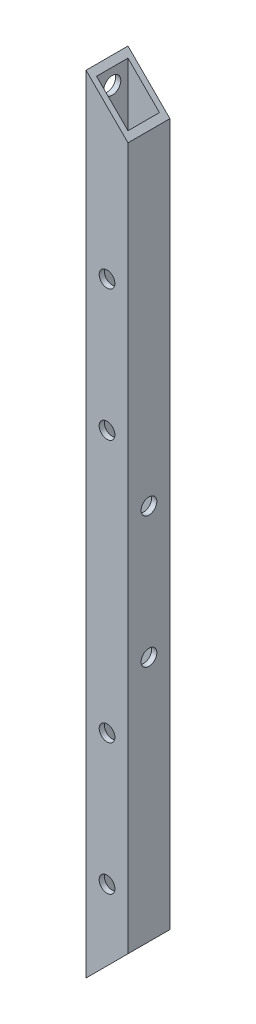
ISO-10303-21;
HEADER;
FILE_DESCRIPTION(('STEP AP214'),'2;1');
FILE_NAME('part.step','',(''),(''),'','','');
FILE_SCHEMA(('AUTOMOTIVE_DESIGN { 1 0 10303 214 1 1 1 1 }'));
ENDSEC;
DATA;
#1=APPLICATION_CONTEXT('core data for automotive mechanical design processes');
#2=APPLICATION_PROTOCOL_DEFINITION('international standard','automotive_design',2000,#1);
#3=PRODUCT_CONTEXT('',#1,'mechanical');
#4=PRODUCT('Part','Part','',(#3));
#5=PRODUCT_RELATED_PRODUCT_CATEGORY('part','',(#4));
#6=PRODUCT_DEFINITION_FORMATION('','',#4);
#7=PRODUCT_DEFINITION_CONTEXT('part definition',#1,'design');
#8=PRODUCT_DEFINITION('design','',#6,#7);
#9=PRODUCT_DEFINITION_SHAPE('','',#8);
#10=(LENGTH_UNIT() NAMED_UNIT(*) SI_UNIT(.MILLI.,.METRE.));
#11=(NAMED_UNIT(*) PLANE_ANGLE_UNIT() SI_UNIT($,.RADIAN.));
#12=(NAMED_UNIT(*) SI_UNIT($,.STERADIAN.) SOLID_ANGLE_UNIT());
#13=UNCERTAINTY_MEASURE_WITH_UNIT(LENGTH_MEASURE(1.E-05),#10,'distance_accuracy_value','');
#14=(GEOMETRIC_REPRESENTATION_CONTEXT(3) GLOBAL_UNCERTAINTY_ASSIGNED_CONTEXT((#13)) GLOBAL_UNIT_ASSIGNED_CONTEXT((#10,
#11,#12)) REPRESENTATION_CONTEXT('',''));
#15=CARTESIAN_POINT('',(0.,0.,0.));
#16=DIRECTION('',(0.,0.,1.));
#17=DIRECTION('',(1.,0.,0.));
#18=AXIS2_PLACEMENT_3D('',#15,#16,#17);
#19=CARTESIAN_POINT('',(4.,150.,-4.));
#20=DIRECTION('',(-1.,0.,0.));
#21=DIRECTION('',(0.,0.,1.));
#22=AXIS2_PLACEMENT_3D('',#19,#20,#21);
#23=PLANE('',#22);
#24=CARTESIAN_POINT('',(4.,80.,0.));
#25=DIRECTION('',(1.,0.,0.));
#26=DIRECTION('',(0.,0.,-1.));
#27=AXIS2_PLACEMENT_3D('',#24,#25,#26);
#28=CIRCLE('',#27,1.5);
#29=CARTESIAN_POINT('',(4.,80.,-1.50000000000001));
#30=VERTEX_POINT('',#29);
#31=EDGE_CURVE('E153',#30,#30,#28,.T.);
#32=ORIENTED_EDGE('',*,*,#31,.F.);
#33=EDGE_LOOP('',(#32));
#34=FACE_BOUND('',#33,.T.);
#35=CARTESIAN_POINT('',(4.,55.,0.));
#36=DIRECTION('',(1.,0.,0.));
#37=DIRECTION('',(0.,0.,-1.));
#38=AXIS2_PLACEMENT_3D('',#35,#36,#37);
#39=CIRCLE('',#38,1.5);
#40=CARTESIAN_POINT('',(4.,55.,-1.50000000000001));
#41=VERTEX_POINT('',#40);
#42=EDGE_CURVE('E229',#41,#41,#39,.T.);
#43=ORIENTED_EDGE('',*,*,#42,.F.);
#44=EDGE_LOOP('',(#43));
#45=FACE_BOUND('',#44,.T.);
#46=DIRECTION('',(0.,-1.,0.));
#47=VECTOR('',#46,1.);
#48=CARTESIAN_POINT('',(4.,150.,-4.));
#49=LINE('',#48,#47);
#50=CARTESIAN_POINT('',(4.,142.,-4.));
#51=VERTEX_POINT('',#50);
#52=CARTESIAN_POINT('',(4.,7.99999999999984,-4.));
#53=VERTEX_POINT('',#52);
#54=EDGE_CURVE('E133',#51,#53,#49,.T.);
#55=ORIENTED_EDGE('',*,*,#54,.F.);
#56=DIRECTION('',(0.,0.,-1.));
#57=VECTOR('',#56,1.);
#58=CARTESIAN_POINT('',(4.,142.,6.));
#59=LINE('',#58,#57);
#60=CARTESIAN_POINT('',(4.,142.,4.));
#61=VERTEX_POINT('',#60);
#62=EDGE_CURVE('E115',#61,#51,#59,.T.);
#63=ORIENTED_EDGE('',*,*,#62,.F.);
#64=DIRECTION('',(0.,-1.,0.));
#65=VECTOR('',#64,1.);
#66=CARTESIAN_POINT('',(4.,150.,4.));
#67=LINE('',#66,#65);
#68=CARTESIAN_POINT('',(4.,7.99999999999984,4.));
#69=VERTEX_POINT('',#68);
#70=EDGE_CURVE('E269',#61,#69,#67,.T.);
#71=ORIENTED_EDGE('',*,*,#70,.T.);
#72=DIRECTION('',(0.,0.,-1.));
#73=VECTOR('',#72,1.);
#74=CARTESIAN_POINT('',(4.,7.99999999999984,6.));
#75=LINE('',#74,#73);
#76=EDGE_CURVE('E67',#69,#53,#75,.T.);
#77=ORIENTED_EDGE('',*,*,#76,.T.);
#78=EDGE_LOOP('',(#55,#63,#71,#77));
#79=FACE_BOUND('',#78,.T.);
#80=ADVANCED_FACE('F50',(#34,#45,#79),#23,.F.);
#81=CARTESIAN_POINT('',(-4.,150.,-4.));
#82=DIRECTION('',(0.,0.,1.));
#83=DIRECTION('',(1.,0.,0.));
#84=AXIS2_PLACEMENT_3D('',#81,#82,#83);
#85=PLANE('',#84);
#86=CARTESIAN_POINT('',(0.,17.5,-4.));
#87=DIRECTION('',(0.,0.,1.));
#88=DIRECTION('',(1.,0.,0.));
#89=AXIS2_PLACEMENT_3D('',#86,#87,#88);
#90=CIRCLE('',#89,1.5);
#91=CARTESIAN_POINT('',(1.50000000000002,17.5,-4.));
#92=VERTEX_POINT('',#91);
#93=EDGE_CURVE('E199',#92,#92,#90,.T.);
#94=ORIENTED_EDGE('',*,*,#93,.T.);
#95=EDGE_LOOP('',(#94));
#96=FACE_BOUND('',#95,.T.);
#97=CARTESIAN_POINT('',(0.,42.5,-4.));
#98=DIRECTION('',(0.,0.,1.));
#99=DIRECTION('',(1.,0.,0.));
#100=AXIS2_PLACEMENT_3D('',#97,#98,#99);
#101=CIRCLE('',#100,1.5);
#102=CARTESIAN_POINT('',(1.50000000000002,42.5,-4.));
#103=VERTEX_POINT('',#102);
#104=EDGE_CURVE('E181',#103,#103,#101,.T.);
#105=ORIENTED_EDGE('',*,*,#104,.T.);
#106=EDGE_LOOP('',(#105));
#107=FACE_BOUND('',#106,.T.);
#108=CARTESIAN_POINT('',(0.,92.5,-4.));
#109=DIRECTION('',(0.,0.,1.));
#110=DIRECTION('',(1.,0.,0.));
#111=AXIS2_PLACEMENT_3D('',#108,#109,#110);
#112=CIRCLE('',#111,1.5);
#113=CARTESIAN_POINT('',(1.50000000000002,92.5,-4.));
#114=VERTEX_POINT('',#113);
#115=EDGE_CURVE('E175',#114,#114,#112,.T.);
#116=ORIENTED_EDGE('',*,*,#115,.T.);
#117=EDGE_LOOP('',(#116));
#118=FACE_BOUND('',#117,.T.);
#119=CARTESIAN_POINT('',(0.,117.5,-4.));
#120=DIRECTION('',(0.,0.,1.));
#121=DIRECTION('',(1.,0.,0.));
#122=AXIS2_PLACEMENT_3D('',#119,#120,#121);
#123=CIRCLE('',#122,1.5);
#124=CARTESIAN_POINT('',(1.50000000000001,117.5,-4.));
#125=VERTEX_POINT('',#124);
#126=EDGE_CURVE('E170',#125,#125,#123,.T.);
#127=ORIENTED_EDGE('',*,*,#126,.T.);
#128=EDGE_LOOP('',(#127));
#129=FACE_BOUND('',#128,.T.);
#130=DIRECTION('',(0.,-1.,0.));
#131=VECTOR('',#130,1.);
#132=CARTESIAN_POINT('',(-4.,150.,-4.));
#133=LINE('',#132,#131);
#134=CARTESIAN_POINT('',(-4.,150.,-4.));
#135=VERTEX_POINT('',#134);
#136=CARTESIAN_POINT('',(-4.,0.,-4.));
#137=VERTEX_POINT('',#136);
#138=EDGE_CURVE('E135',#135,#137,#133,.T.);
#139=ORIENTED_EDGE('',*,*,#138,.F.);
#140=DIRECTION('',(-0.70710678118654,0.707106781186555,0.));
#141=VECTOR('',#140,1.);
#142=CARTESIAN_POINT('',(-4.,150.,-4.));
#143=LINE('',#142,#141);
#144=EDGE_CURVE('E118',#51,#135,#143,.T.);
#145=ORIENTED_EDGE('',*,*,#144,.F.);
#146=ORIENTED_EDGE('',*,*,#54,.T.);
#147=DIRECTION('',(0.707106781186555,0.70710678118654,0.));
#148=VECTOR('',#147,1.);
#149=CARTESIAN_POINT('',(-4.,0.,-4.));
#150=LINE('',#149,#148);
#151=EDGE_CURVE('E202',#137,#53,#150,.T.);
#152=ORIENTED_EDGE('',*,*,#151,.F.);
#153=EDGE_LOOP('',(#139,#145,#146,#152));
#154=FACE_BOUND('',#153,.T.);
#155=ADVANCED_FACE('F131',(#96,#107,#118,#129,#154),#85,.F.);
#156=CARTESIAN_POINT('',(-4.,150.,-4.));
#157=DIRECTION('',(1.,0.,0.));
#158=DIRECTION('',(0.,0.,-1.));
#159=AXIS2_PLACEMENT_3D('',#156,#157,#158);
#160=PLANE('',#159);
#161=CARTESIAN_POINT('',(-4.,146.,0.));
#162=DIRECTION('',(1.,0.,0.));
#163=DIRECTION('',(0.,0.,-1.));
#164=AXIS2_PLACEMENT_3D('',#161,#162,#163);
#165=CIRCLE('',#164,1.625);
#166=CARTESIAN_POINT('',(-4.,146.,-1.625));
#167=VERTEX_POINT('',#166);
#168=EDGE_CURVE('E393',#167,#167,#165,.T.);
#169=ORIENTED_EDGE('',*,*,#168,.T.);
#170=EDGE_LOOP('',(#169));
#171=FACE_BOUND('',#170,.T.);
#172=CARTESIAN_POINT('',(-4.,4.,0.));
#173=DIRECTION('',(1.,0.,0.));
#174=DIRECTION('',(0.,0.,-1.));
#175=AXIS2_PLACEMENT_3D('',#172,#173,#174);
#176=CIRCLE('',#175,1.625);
#177=CARTESIAN_POINT('',(-4.,4.,-1.625));
#178=VERTEX_POINT('',#177);
#179=EDGE_CURVE('E387',#178,#178,#176,.T.);
#180=ORIENTED_EDGE('',*,*,#179,.T.);
#181=EDGE_LOOP('',(#180));
#182=FACE_BOUND('',#181,.T.);
#183=CARTESIAN_POINT('',(-4.,80.,0.));
#184=DIRECTION('',(1.,0.,0.));
#185=DIRECTION('',(0.,0.,-1.));
#186=AXIS2_PLACEMENT_3D('',#183,#184,#185);
#187=CIRCLE('',#186,1.5);
#188=CARTESIAN_POINT('',(-4.,80.,-1.50000000000001));
#189=VERTEX_POINT('',#188);
#190=EDGE_CURVE('E245',#189,#189,#187,.T.);
#191=ORIENTED_EDGE('',*,*,#190,.T.);
#192=EDGE_LOOP('',(#191));
#193=FACE_BOUND('',#192,.T.);
#194=CARTESIAN_POINT('',(-4.,55.,0.));
#195=DIRECTION('',(1.,0.,0.));
#196=DIRECTION('',(0.,0.,-1.));
#197=AXIS2_PLACEMENT_3D('',#194,#195,#196);
#198=CIRCLE('',#197,1.5);
#199=CARTESIAN_POINT('',(-4.,55.,-1.50000000000001));
#200=VERTEX_POINT('',#199);
#201=EDGE_CURVE('E158',#200,#200,#198,.T.);
#202=ORIENTED_EDGE('',*,*,#201,.T.);
#203=EDGE_LOOP('',(#202));
#204=FACE_BOUND('',#203,.T.);
#205=DIRECTION('',(0.,0.,1.));
#206=VECTOR('',#205,1.);
#207=CARTESIAN_POINT('',(-4.,0.,-4.));
#208=LINE('',#207,#206);
#209=CARTESIAN_POINT('',(-4.,0.,4.));
#210=VERTEX_POINT('',#209);
#211=EDGE_CURVE('E265',#137,#210,#208,.T.);
#212=ORIENTED_EDGE('',*,*,#211,.T.);
#213=DIRECTION('',(0.,-1.,0.));
#214=VECTOR('',#213,1.);
#215=CARTESIAN_POINT('',(-4.,150.,4.));
#216=LINE('',#215,#214);
#217=CARTESIAN_POINT('',(-4.,150.,4.));
#218=VERTEX_POINT('',#217);
#219=EDGE_CURVE('E144',#218,#210,#216,.T.);
#220=ORIENTED_EDGE('',*,*,#219,.F.);
#221=DIRECTION('',(0.,0.,1.));
#222=VECTOR('',#221,1.);
#223=CARTESIAN_POINT('',(-4.,150.,-4.));
#224=LINE('',#223,#222);
#225=EDGE_CURVE('E266',#135,#218,#224,.T.);
#226=ORIENTED_EDGE('',*,*,#225,.F.);
#227=ORIENTED_EDGE('',*,*,#138,.T.);
#228=EDGE_LOOP('',(#212,#220,#226,#227));
#229=FACE_BOUND('',#228,.T.);
#230=ADVANCED_FACE('F280',(#171,#182,#193,#204,#229),#160,.F.);
#231=CARTESIAN_POINT('',(-4.,150.,4.));
#232=DIRECTION('',(0.,0.,-1.));
#233=DIRECTION('',(-1.,0.,0.));
#234=AXIS2_PLACEMENT_3D('',#231,#232,#233);
#235=PLANE('',#234);
#236=CARTESIAN_POINT('',(0.,17.5,4.));
#237=DIRECTION('',(0.,0.,1.));
#238=DIRECTION('',(1.,0.,0.));
#239=AXIS2_PLACEMENT_3D('',#236,#237,#238);
#240=CIRCLE('',#239,1.5);
#241=CARTESIAN_POINT('',(1.50000000000002,17.5,4.));
#242=VERTEX_POINT('',#241);
#243=EDGE_CURVE('E165',#242,#242,#240,.T.);
#244=ORIENTED_EDGE('',*,*,#243,.F.);
#245=EDGE_LOOP('',(#244));
#246=FACE_BOUND('',#245,.T.);
#247=CARTESIAN_POINT('',(0.,42.5,4.));
#248=DIRECTION('',(0.,0.,1.));
#249=DIRECTION('',(1.,0.,0.));
#250=AXIS2_PLACEMENT_3D('',#247,#248,#249);
#251=CIRCLE('',#250,1.5);
#252=CARTESIAN_POINT('',(1.50000000000002,42.5,4.));
#253=VERTEX_POINT('',#252);
#254=EDGE_CURVE('E400',#253,#253,#251,.T.);
#255=ORIENTED_EDGE('',*,*,#254,.F.);
#256=EDGE_LOOP('',(#255));
#257=FACE_BOUND('',#256,.T.);
#258=CARTESIAN_POINT('',(0.,92.5,4.));
#259=DIRECTION('',(0.,0.,1.));
#260=DIRECTION('',(-1.,0.,0.));
#261=AXIS2_PLACEMENT_3D('',#258,#259,#260);
#262=CIRCLE('',#261,1.5);
#263=CARTESIAN_POINT('',(-1.49999999999999,92.5,4.));
#264=VERTEX_POINT('',#263);
#265=EDGE_CURVE('E404',#264,#264,#262,.T.);
#266=ORIENTED_EDGE('',*,*,#265,.F.);
#267=EDGE_LOOP('',(#266));
#268=FACE_BOUND('',#267,.T.);
#269=CARTESIAN_POINT('',(0.,117.5,4.));
#270=DIRECTION('',(0.,0.,1.));
#271=DIRECTION('',(1.,0.,0.));
#272=AXIS2_PLACEMENT_3D('',#269,#270,#271);
#273=CIRCLE('',#272,1.5);
#274=CARTESIAN_POINT('',(1.50000000000001,117.5,4.));
#275=VERTEX_POINT('',#274);
#276=EDGE_CURVE('E396',#275,#275,#273,.T.);
#277=ORIENTED_EDGE('',*,*,#276,.F.);
#278=EDGE_LOOP('',(#277));
#279=FACE_BOUND('',#278,.T.);
#280=ORIENTED_EDGE('',*,*,#70,.F.);
#281=DIRECTION('',(-0.70710678118654,0.707106781186555,0.));
#282=VECTOR('',#281,1.);
#283=CARTESIAN_POINT('',(-4.,150.,4.));
#284=LINE('',#283,#282);
#285=EDGE_CURVE('E121',#61,#218,#284,.T.);
#286=ORIENTED_EDGE('',*,*,#285,.T.);
#287=ORIENTED_EDGE('',*,*,#219,.T.);
#288=DIRECTION('',(0.707106781186555,0.70710678118654,0.));
#289=VECTOR('',#288,1.);
#290=CARTESIAN_POINT('',(71.,74.9999999999985,4.));
#291=LINE('',#290,#289);
#292=EDGE_CURVE('E216',#210,#69,#291,.T.);
#293=ORIENTED_EDGE('',*,*,#292,.T.);
#294=EDGE_LOOP('',(#280,#286,#287,#293));
#295=FACE_BOUND('',#294,.T.);
#296=ADVANCED_FACE('F278',(#246,#257,#268,#279,#295),#235,.F.);
#297=CARTESIAN_POINT('',(3.,150.,-3.));
#298=DIRECTION('',(-1.,0.,0.));
#299=DIRECTION('',(0.,0.,1.));
#300=AXIS2_PLACEMENT_3D('',#297,#298,#299);
#301=PLANE('',#300);
#302=DIRECTION('',(0.,0.,1.));
#303=VECTOR('',#302,1.);
#304=CARTESIAN_POINT('',(3.,143.,-3.));
#305=LINE('',#304,#303);
#306=CARTESIAN_POINT('',(3.,143.,-3.));
#307=VERTEX_POINT('',#306);
#308=CARTESIAN_POINT('',(3.,143.,3.));
#309=VERTEX_POINT('',#308);
#310=EDGE_CURVE('E74',#307,#309,#305,.T.);
#311=ORIENTED_EDGE('',*,*,#310,.F.);
#312=DIRECTION('',(0.,-1.,0.));
#313=VECTOR('',#312,1.);
#314=CARTESIAN_POINT('',(3.,150.,-3.));
#315=LINE('',#314,#313);
#316=CARTESIAN_POINT('',(3.,6.99999999999988,-3.));
#317=VERTEX_POINT('',#316);
#318=EDGE_CURVE('E261',#307,#317,#315,.T.);
#319=ORIENTED_EDGE('',*,*,#318,.T.);
#320=DIRECTION('',(0.,0.,-1.));
#321=VECTOR('',#320,1.);
#322=CARTESIAN_POINT('',(3.,6.99999999999987,-3.));
#323=LINE('',#322,#321);
#324=CARTESIAN_POINT('',(3.,6.99999999999988,3.));
#325=VERTEX_POINT('',#324);
#326=EDGE_CURVE('E213',#325,#317,#323,.T.);
#327=ORIENTED_EDGE('',*,*,#326,.F.);
#328=DIRECTION('',(0.,-1.,0.));
#329=VECTOR('',#328,1.);
#330=CARTESIAN_POINT('',(3.,150.,3.));
#331=LINE('',#330,#329);
#332=EDGE_CURVE('E249',#309,#325,#331,.T.);
#333=ORIENTED_EDGE('',*,*,#332,.F.);
#334=EDGE_LOOP('',(#311,#319,#327,#333));
#335=FACE_BOUND('',#334,.T.);
#336=CARTESIAN_POINT('',(3.,80.,0.));
#337=DIRECTION('',(-1.,0.,0.));
#338=DIRECTION('',(0.,0.,1.));
#339=AXIS2_PLACEMENT_3D('',#336,#337,#338);
#340=CIRCLE('',#339,1.5);
#341=CARTESIAN_POINT('',(3.,80.,1.49999999999999));
#342=VERTEX_POINT('',#341);
#343=EDGE_CURVE('E157',#342,#342,#340,.T.);
#344=ORIENTED_EDGE('',*,*,#343,.F.);
#345=EDGE_LOOP('',(#344));
#346=FACE_BOUND('',#345,.T.);
#347=CARTESIAN_POINT('',(3.,55.,0.));
#348=DIRECTION('',(-1.,0.,0.));
#349=DIRECTION('',(0.,0.,1.));
#350=AXIS2_PLACEMENT_3D('',#347,#348,#349);
#351=CIRCLE('',#350,1.5);
#352=CARTESIAN_POINT('',(3.,55.,1.49999999999999));
#353=VERTEX_POINT('',#352);
#354=EDGE_CURVE('E152',#353,#353,#351,.T.);
#355=ORIENTED_EDGE('',*,*,#354,.F.);
#356=EDGE_LOOP('',(#355));
#357=FACE_BOUND('',#356,.T.);
#358=ADVANCED_FACE('F335',(#335,#346,#357),#301,.T.);
#359=CARTESIAN_POINT('',(-3.,150.,-3.));
#360=DIRECTION('',(0.,0.,1.));
#361=DIRECTION('',(1.,0.,0.));
#362=AXIS2_PLACEMENT_3D('',#359,#360,#361);
#363=PLANE('',#362);
#364=CARTESIAN_POINT('',(0.,17.5,-3.));
#365=DIRECTION('',(0.,0.,1.));
#366=DIRECTION('',(1.,0.,0.));
#367=AXIS2_PLACEMENT_3D('',#364,#365,#366);
#368=CIRCLE('',#367,1.5);
#369=CARTESIAN_POINT('',(1.50000000000002,17.5,-3.));
#370=VERTEX_POINT('',#369);
#371=EDGE_CURVE('E195',#370,#370,#368,.T.);
#372=ORIENTED_EDGE('',*,*,#371,.F.);
#373=EDGE_LOOP('',(#372));
#374=FACE_BOUND('',#373,.T.);
#375=CARTESIAN_POINT('',(0.,42.5,-3.));
#376=DIRECTION('',(0.,0.,1.));
#377=DIRECTION('',(1.,0.,0.));
#378=AXIS2_PLACEMENT_3D('',#375,#376,#377);
#379=CIRCLE('',#378,1.5);
#380=CARTESIAN_POINT('',(1.50000000000002,42.5,-3.));
#381=VERTEX_POINT('',#380);
#382=EDGE_CURVE('E174',#381,#381,#379,.T.);
#383=ORIENTED_EDGE('',*,*,#382,.F.);
#384=EDGE_LOOP('',(#383));
#385=FACE_BOUND('',#384,.T.);
#386=CARTESIAN_POINT('',(0.,92.5,-3.));
#387=DIRECTION('',(0.,0.,1.));
#388=DIRECTION('',(1.,0.,0.));
#389=AXIS2_PLACEMENT_3D('',#386,#387,#388);
#390=CIRCLE('',#389,1.5);
#391=CARTESIAN_POINT('',(1.50000000000002,92.5,-3.));
#392=VERTEX_POINT('',#391);
#393=EDGE_CURVE('E169',#392,#392,#390,.T.);
#394=ORIENTED_EDGE('',*,*,#393,.F.);
#395=EDGE_LOOP('',(#394));
#396=FACE_BOUND('',#395,.T.);
#397=CARTESIAN_POINT('',(0.,117.5,-3.));
#398=DIRECTION('',(0.,0.,1.));
#399=DIRECTION('',(1.,0.,0.));
#400=AXIS2_PLACEMENT_3D('',#397,#398,#399);
#401=CIRCLE('',#400,1.5);
#402=CARTESIAN_POINT('',(1.50000000000001,117.5,-3.));
#403=VERTEX_POINT('',#402);
#404=EDGE_CURVE('E164',#403,#403,#401,.T.);
#405=ORIENTED_EDGE('',*,*,#404,.F.);
#406=EDGE_LOOP('',(#405));
#407=FACE_BOUND('',#406,.T.);
#408=DIRECTION('',(0.70710678118654,-0.707106781186555,0.));
#409=VECTOR('',#408,1.);
#410=CARTESIAN_POINT('',(-3.50000000000001,149.5,-3.));
#411=LINE('',#410,#409);
#412=CARTESIAN_POINT('',(-3.,149.,-3.));
#413=VERTEX_POINT('',#412);
#414=EDGE_CURVE('E222',#413,#307,#411,.T.);
#415=ORIENTED_EDGE('',*,*,#414,.F.);
#416=DIRECTION('',(0.,-1.,0.));
#417=VECTOR('',#416,1.);
#418=CARTESIAN_POINT('',(-3.,150.,-3.));
#419=LINE('',#418,#417);
#420=CARTESIAN_POINT('',(-3.,0.999999999999973,-3.));
#421=VERTEX_POINT('',#420);
#422=EDGE_CURVE('E257',#413,#421,#419,.T.);
#423=ORIENTED_EDGE('',*,*,#422,.T.);
#424=DIRECTION('',(-0.707106781186555,-0.70710678118654,0.));
#425=VECTOR('',#424,1.);
#426=CARTESIAN_POINT('',(71.5,75.4999999999985,-3.));
#427=LINE('',#426,#425);
#428=EDGE_CURVE('E210',#317,#421,#427,.T.);
#429=ORIENTED_EDGE('',*,*,#428,.F.);
#430=ORIENTED_EDGE('',*,*,#318,.F.);
#431=EDGE_LOOP('',(#415,#423,#429,#430));
#432=FACE_BOUND('',#431,.T.);
#433=ADVANCED_FACE('F343',(#374,#385,#396,#407,#432),#363,.T.);
#434=CARTESIAN_POINT('',(-3.,150.,-3.));
#435=DIRECTION('',(1.,0.,0.));
#436=DIRECTION('',(0.,0.,-1.));
#437=AXIS2_PLACEMENT_3D('',#434,#435,#436);
#438=PLANE('',#437);
#439=CARTESIAN_POINT('',(-3.,146.,0.));
#440=DIRECTION('',(1.,0.,0.));
#441=DIRECTION('',(0.,0.,-1.));
#442=AXIS2_PLACEMENT_3D('',#439,#440,#441);
#443=CIRCLE('',#442,1.625);
#444=CARTESIAN_POINT('',(-3.,146.,-1.625));
#445=VERTEX_POINT('',#444);
#446=EDGE_CURVE('E355',#445,#445,#443,.T.);
#447=ORIENTED_EDGE('',*,*,#446,.F.);
#448=EDGE_LOOP('',(#447));
#449=FACE_BOUND('',#448,.T.);
#450=CARTESIAN_POINT('',(-3.,4.,0.));
#451=DIRECTION('',(1.,0.,0.));
#452=DIRECTION('',(0.,0.,-1.));
#453=AXIS2_PLACEMENT_3D('',#450,#451,#452);
#454=CIRCLE('',#453,1.625);
#455=CARTESIAN_POINT('',(-3.,4.,-1.625));
#456=VERTEX_POINT('',#455);
#457=EDGE_CURVE('E359',#456,#456,#454,.T.);
#458=ORIENTED_EDGE('',*,*,#457,.F.);
#459=EDGE_LOOP('',(#458));
#460=FACE_BOUND('',#459,.T.);
#461=DIRECTION('',(0.,0.,-1.));
#462=VECTOR('',#461,1.);
#463=CARTESIAN_POINT('',(-3.,149.,-3.));
#464=LINE('',#463,#462);
#465=CARTESIAN_POINT('',(-3.,149.,3.));
#466=VERTEX_POINT('',#465);
#467=EDGE_CURVE('E219',#466,#413,#464,.T.);
#468=ORIENTED_EDGE('',*,*,#467,.F.);
#469=DIRECTION('',(0.,-1.,0.));
#470=VECTOR('',#469,1.);
#471=CARTESIAN_POINT('',(-3.,150.,3.));
#472=LINE('',#471,#470);
#473=CARTESIAN_POINT('',(-2.99999999999999,1.,3.));
#474=VERTEX_POINT('',#473);
#475=EDGE_CURVE('E253',#466,#474,#472,.T.);
#476=ORIENTED_EDGE('',*,*,#475,.T.);
#477=DIRECTION('',(0.,0.,1.));
#478=VECTOR('',#477,1.);
#479=CARTESIAN_POINT('',(-3.,0.999999999999973,-3.));
#480=LINE('',#479,#478);
#481=EDGE_CURVE('E127',#421,#474,#480,.T.);
#482=ORIENTED_EDGE('',*,*,#481,.F.);
#483=ORIENTED_EDGE('',*,*,#422,.F.);
#484=EDGE_LOOP('',(#468,#476,#482,#483));
#485=FACE_BOUND('',#484,.T.);
#486=CARTESIAN_POINT('',(-3.,80.,0.));
#487=DIRECTION('',(1.,0.,0.));
#488=DIRECTION('',(0.,0.,-1.));
#489=AXIS2_PLACEMENT_3D('',#486,#487,#488);
#490=CIRCLE('',#489,1.5);
#491=CARTESIAN_POINT('',(-3.,80.,-1.50000000000001));
#492=VERTEX_POINT('',#491);
#493=EDGE_CURVE('E154',#492,#492,#490,.T.);
#494=ORIENTED_EDGE('',*,*,#493,.F.);
#495=EDGE_LOOP('',(#494));
#496=FACE_BOUND('',#495,.T.);
#497=CARTESIAN_POINT('',(-3.,55.,0.));
#498=DIRECTION('',(1.,0.,0.));
#499=DIRECTION('',(0.,0.,-1.));
#500=AXIS2_PLACEMENT_3D('',#497,#498,#499);
#501=CIRCLE('',#500,1.5);
#502=CARTESIAN_POINT('',(-3.,55.,-1.50000000000001));
#503=VERTEX_POINT('',#502);
#504=EDGE_CURVE('E148',#503,#503,#501,.T.);
#505=ORIENTED_EDGE('',*,*,#504,.F.);
#506=EDGE_LOOP('',(#505));
#507=FACE_BOUND('',#506,.T.);
#508=ADVANCED_FACE('F321',(#449,#460,#485,#496,#507),#438,.T.);
#509=CARTESIAN_POINT('',(-3.,150.,3.));
#510=DIRECTION('',(0.,0.,-1.));
#511=DIRECTION('',(-1.,0.,0.));
#512=AXIS2_PLACEMENT_3D('',#509,#510,#511);
#513=PLANE('',#512);
#514=CARTESIAN_POINT('',(0.,17.5,3.));
#515=DIRECTION('',(0.,0.,-1.));
#516=DIRECTION('',(-1.,0.,0.));
#517=AXIS2_PLACEMENT_3D('',#514,#515,#516);
#518=CIRCLE('',#517,1.5);
#519=CARTESIAN_POINT('',(-1.49999999999998,17.5,3.));
#520=VERTEX_POINT('',#519);
#521=EDGE_CURVE('E53',#520,#520,#518,.T.);
#522=ORIENTED_EDGE('',*,*,#521,.F.);
#523=EDGE_LOOP('',(#522));
#524=FACE_BOUND('',#523,.T.);
#525=CARTESIAN_POINT('',(0.,42.5,3.));
#526=DIRECTION('',(0.,0.,-1.));
#527=DIRECTION('',(-1.,0.,0.));
#528=AXIS2_PLACEMENT_3D('',#525,#526,#527);
#529=CIRCLE('',#528,1.5);
#530=CARTESIAN_POINT('',(-1.49999999999998,42.5,3.));
#531=VERTEX_POINT('',#530);
#532=EDGE_CURVE('E171',#531,#531,#529,.T.);
#533=ORIENTED_EDGE('',*,*,#532,.F.);
#534=EDGE_LOOP('',(#533));
#535=FACE_BOUND('',#534,.T.);
#536=CARTESIAN_POINT('',(0.,92.5,3.));
#537=DIRECTION('',(0.,0.,-1.));
#538=DIRECTION('',(-1.,0.,0.));
#539=AXIS2_PLACEMENT_3D('',#536,#537,#538);
#540=CIRCLE('',#539,1.5);
#541=CARTESIAN_POINT('',(-1.49999999999999,92.5,3.));
#542=VERTEX_POINT('',#541);
#543=EDGE_CURVE('E166',#542,#542,#540,.T.);
#544=ORIENTED_EDGE('',*,*,#543,.F.);
#545=EDGE_LOOP('',(#544));
#546=FACE_BOUND('',#545,.T.);
#547=CARTESIAN_POINT('',(0.,117.5,3.));
#548=DIRECTION('',(0.,0.,-1.));
#549=DIRECTION('',(-1.,0.,0.));
#550=AXIS2_PLACEMENT_3D('',#547,#548,#549);
#551=CIRCLE('',#550,1.5);
#552=CARTESIAN_POINT('',(-1.49999999999999,117.5,3.));
#553=VERTEX_POINT('',#552);
#554=EDGE_CURVE('E160',#553,#553,#551,.T.);
#555=ORIENTED_EDGE('',*,*,#554,.F.);
#556=EDGE_LOOP('',(#555));
#557=FACE_BOUND('',#556,.T.);
#558=DIRECTION('',(-0.70710678118654,0.707106781186555,0.));
#559=VECTOR('',#558,1.);
#560=CARTESIAN_POINT('',(-3.50000000000001,149.5,3.));
#561=LINE('',#560,#559);
#562=EDGE_CURVE('E13',#309,#466,#561,.T.);
#563=ORIENTED_EDGE('',*,*,#562,.F.);
#564=ORIENTED_EDGE('',*,*,#332,.T.);
#565=DIRECTION('',(0.707106781186555,0.70710678118654,0.));
#566=VECTOR('',#565,1.);
#567=CARTESIAN_POINT('',(71.5,75.4999999999985,3.));
#568=LINE('',#567,#566);
#569=EDGE_CURVE('E59',#474,#325,#568,.T.);
#570=ORIENTED_EDGE('',*,*,#569,.F.);
#571=ORIENTED_EDGE('',*,*,#475,.F.);
#572=EDGE_LOOP('',(#563,#564,#570,#571));
#573=FACE_BOUND('',#572,.T.);
#574=ADVANCED_FACE('F316',(#524,#535,#546,#557,#573),#513,.T.);
#575=CARTESIAN_POINT('',(-6.,55.,0.));
#576=DIRECTION('',(1.,0.,0.));
#577=DIRECTION('',(0.,0.,-1.));
#578=AXIS2_PLACEMENT_3D('',#575,#576,#577);
#579=CYLINDRICAL_SURFACE('',#578,1.5);
#580=ORIENTED_EDGE('',*,*,#504,.T.);
#581=EDGE_LOOP('',(#580));
#582=FACE_BOUND('',#581,.T.);
#583=ORIENTED_EDGE('',*,*,#201,.F.);
#584=EDGE_LOOP('',(#583));
#585=FACE_BOUND('',#584,.T.);
#586=ADVANCED_FACE('F309',(#582,#585),#579,.F.);
#587=CARTESIAN_POINT('',(-6.,80.,0.));
#588=DIRECTION('',(1.,0.,0.));
#589=DIRECTION('',(0.,0.,-1.));
#590=AXIS2_PLACEMENT_3D('',#587,#588,#589);
#591=CYLINDRICAL_SURFACE('',#590,1.5);
#592=ORIENTED_EDGE('',*,*,#493,.T.);
#593=EDGE_LOOP('',(#592));
#594=FACE_BOUND('',#593,.T.);
#595=ORIENTED_EDGE('',*,*,#190,.F.);
#596=EDGE_LOOP('',(#595));
#597=FACE_BOUND('',#596,.T.);
#598=ADVANCED_FACE('F295',(#594,#597),#591,.F.);
#599=ORIENTED_EDGE('',*,*,#354,.T.);
#600=EDGE_LOOP('',(#599));
#601=FACE_BOUND('',#600,.T.);
#602=ORIENTED_EDGE('',*,*,#42,.T.);
#603=EDGE_LOOP('',(#602));
#604=FACE_BOUND('',#603,.T.);
#605=ADVANCED_FACE('F292',(#601,#604),#579,.F.);
#606=ORIENTED_EDGE('',*,*,#343,.T.);
#607=EDGE_LOOP('',(#606));
#608=FACE_BOUND('',#607,.T.);
#609=ORIENTED_EDGE('',*,*,#31,.T.);
#610=EDGE_LOOP('',(#609));
#611=FACE_BOUND('',#610,.T.);
#612=ADVANCED_FACE('F283',(#608,#611),#591,.F.);
#613=CARTESIAN_POINT('',(-4.,0.,6.));
#614=DIRECTION('',(-0.70710678118654,0.707106781186555,0.));
#615=DIRECTION('',(-0.707106781186555,-0.70710678118654,0.));
#616=AXIS2_PLACEMENT_3D('',#613,#614,#615);
#617=PLANE('',#616);
#618=ORIENTED_EDGE('',*,*,#326,.T.);
#619=ORIENTED_EDGE('',*,*,#428,.T.);
#620=ORIENTED_EDGE('',*,*,#481,.T.);
#621=ORIENTED_EDGE('',*,*,#569,.T.);
#622=EDGE_LOOP('',(#618,#619,#620,#621));
#623=FACE_BOUND('',#622,.T.);
#624=ORIENTED_EDGE('',*,*,#211,.F.);
#625=ORIENTED_EDGE('',*,*,#151,.T.);
#626=ORIENTED_EDGE('',*,*,#76,.F.);
#627=ORIENTED_EDGE('',*,*,#292,.F.);
#628=EDGE_LOOP('',(#624,#625,#626,#627));
#629=FACE_BOUND('',#628,.T.);
#630=ADVANCED_FACE('F281',(#623,#629),#617,.F.);
#631=CARTESIAN_POINT('',(-4.,150.,6.));
#632=DIRECTION('',(-0.707106781186555,-0.70710678118654,0.));
#633=DIRECTION('',(0.70710678118654,-0.707106781186555,0.));
#634=AXIS2_PLACEMENT_3D('',#631,#632,#633);
#635=PLANE('',#634);
#636=ORIENTED_EDGE('',*,*,#310,.T.);
#637=ORIENTED_EDGE('',*,*,#562,.T.);
#638=ORIENTED_EDGE('',*,*,#467,.T.);
#639=ORIENTED_EDGE('',*,*,#414,.T.);
#640=EDGE_LOOP('',(#636,#637,#638,#639));
#641=FACE_BOUND('',#640,.T.);
#642=ORIENTED_EDGE('',*,*,#62,.T.);
#643=ORIENTED_EDGE('',*,*,#144,.T.);
#644=ORIENTED_EDGE('',*,*,#225,.T.);
#645=ORIENTED_EDGE('',*,*,#285,.F.);
#646=EDGE_LOOP('',(#642,#643,#644,#645));
#647=FACE_BOUND('',#646,.T.);
#648=ADVANCED_FACE('F117',(#641,#647),#635,.F.);
#649=CARTESIAN_POINT('',(0.,117.5,-6.));
#650=DIRECTION('',(0.,0.,1.));
#651=DIRECTION('',(1.,0.,0.));
#652=AXIS2_PLACEMENT_3D('',#649,#650,#651);
#653=CYLINDRICAL_SURFACE('',#652,1.5);
#654=ORIENTED_EDGE('',*,*,#554,.T.);
#655=EDGE_LOOP('',(#654));
#656=FACE_BOUND('',#655,.T.);
#657=ORIENTED_EDGE('',*,*,#276,.T.);
#658=EDGE_LOOP('',(#657));
#659=FACE_BOUND('',#658,.T.);
#660=ADVANCED_FACE('F290',(#656,#659),#653,.F.);
#661=CARTESIAN_POINT('',(0.,92.5,-6.));
#662=DIRECTION('',(0.,0.,1.));
#663=DIRECTION('',(1.,0.,0.));
#664=AXIS2_PLACEMENT_3D('',#661,#662,#663);
#665=CYLINDRICAL_SURFACE('',#664,1.5);
#666=ORIENTED_EDGE('',*,*,#543,.T.);
#667=EDGE_LOOP('',(#666));
#668=FACE_BOUND('',#667,.T.);
#669=ORIENTED_EDGE('',*,*,#265,.T.);
#670=EDGE_LOOP('',(#669));
#671=FACE_BOUND('',#670,.T.);
#672=ADVANCED_FACE('F431',(#668,#671),#665,.F.);
#673=CARTESIAN_POINT('',(0.,42.5,-6.));
#674=DIRECTION('',(0.,0.,1.));
#675=DIRECTION('',(1.,0.,0.));
#676=AXIS2_PLACEMENT_3D('',#673,#674,#675);
#677=CYLINDRICAL_SURFACE('',#676,1.5);
#678=ORIENTED_EDGE('',*,*,#532,.T.);
#679=EDGE_LOOP('',(#678));
#680=FACE_BOUND('',#679,.T.);
#681=ORIENTED_EDGE('',*,*,#254,.T.);
#682=EDGE_LOOP('',(#681));
#683=FACE_BOUND('',#682,.T.);
#684=ADVANCED_FACE('F432',(#680,#683),#677,.F.);
#685=CARTESIAN_POINT('',(0.,17.5,-6.));
#686=DIRECTION('',(0.,0.,1.));
#687=DIRECTION('',(1.,0.,0.));
#688=AXIS2_PLACEMENT_3D('',#685,#686,#687);
#689=CYLINDRICAL_SURFACE('',#688,1.5);
#690=ORIENTED_EDGE('',*,*,#521,.T.);
#691=EDGE_LOOP('',(#690));
#692=FACE_BOUND('',#691,.T.);
#693=ORIENTED_EDGE('',*,*,#243,.T.);
#694=EDGE_LOOP('',(#693));
#695=FACE_BOUND('',#694,.T.);
#696=ADVANCED_FACE('F421',(#692,#695),#689,.F.);
#697=ORIENTED_EDGE('',*,*,#404,.T.);
#698=EDGE_LOOP('',(#697));
#699=FACE_BOUND('',#698,.T.);
#700=ORIENTED_EDGE('',*,*,#126,.F.);
#701=EDGE_LOOP('',(#700));
#702=FACE_BOUND('',#701,.T.);
#703=ADVANCED_FACE('F418',(#699,#702),#653,.F.);
#704=ORIENTED_EDGE('',*,*,#393,.T.);
#705=EDGE_LOOP('',(#704));
#706=FACE_BOUND('',#705,.T.);
#707=ORIENTED_EDGE('',*,*,#115,.F.);
#708=EDGE_LOOP('',(#707));
#709=FACE_BOUND('',#708,.T.);
#710=ADVANCED_FACE('F420',(#706,#709),#665,.F.);
#711=ORIENTED_EDGE('',*,*,#382,.T.);
#712=EDGE_LOOP('',(#711));
#713=FACE_BOUND('',#712,.T.);
#714=ORIENTED_EDGE('',*,*,#104,.F.);
#715=EDGE_LOOP('',(#714));
#716=FACE_BOUND('',#715,.T.);
#717=ADVANCED_FACE('F428',(#713,#716),#677,.F.);
#718=ORIENTED_EDGE('',*,*,#371,.T.);
#719=EDGE_LOOP('',(#718));
#720=FACE_BOUND('',#719,.T.);
#721=ORIENTED_EDGE('',*,*,#93,.F.);
#722=EDGE_LOOP('',(#721));
#723=FACE_BOUND('',#722,.T.);
#724=ADVANCED_FACE('F435',(#720,#723),#689,.F.);
#725=CARTESIAN_POINT('',(-13.,4.,0.));
#726=DIRECTION('',(1.,0.,0.));
#727=DIRECTION('',(0.,0.,-1.));
#728=AXIS2_PLACEMENT_3D('',#725,#726,#727);
#729=CYLINDRICAL_SURFACE('',#728,1.625);
#730=ORIENTED_EDGE('',*,*,#457,.T.);
#731=EDGE_LOOP('',(#730));
#732=FACE_BOUND('',#731,.T.);
#733=ORIENTED_EDGE('',*,*,#179,.F.);
#734=EDGE_LOOP('',(#733));
#735=FACE_BOUND('',#734,.T.);
#736=ADVANCED_FACE('F453',(#732,#735),#729,.F.);
#737=CARTESIAN_POINT('',(-13.,146.,0.));
#738=DIRECTION('',(1.,0.,0.));
#739=DIRECTION('',(0.,0.,-1.));
#740=AXIS2_PLACEMENT_3D('',#737,#738,#739);
#741=CYLINDRICAL_SURFACE('',#740,1.625);
#742=ORIENTED_EDGE('',*,*,#446,.T.);
#743=EDGE_LOOP('',(#742));
#744=FACE_BOUND('',#743,.T.);
#745=ORIENTED_EDGE('',*,*,#168,.F.);
#746=EDGE_LOOP('',(#745));
#747=FACE_BOUND('',#746,.T.);
#748=ADVANCED_FACE('F456',(#744,#747),#741,.F.);
#749=CLOSED_SHELL('',(#80,#155,#230,#296,#358,#433,#508,#574,#586,#598,#605,#612,#630,#648,#660,
#672,#684,#696,#703,#710,#717,#724,#736,#748));
#750=MANIFOLD_SOLID_BREP('B2',#749);
#751=ADVANCED_BREP_SHAPE_REPRESENTATION('',(#18,#750),#14);
#752=SHAPE_DEFINITION_REPRESENTATION(#9,#751);
ENDSEC;
END-ISO-10303-21;
